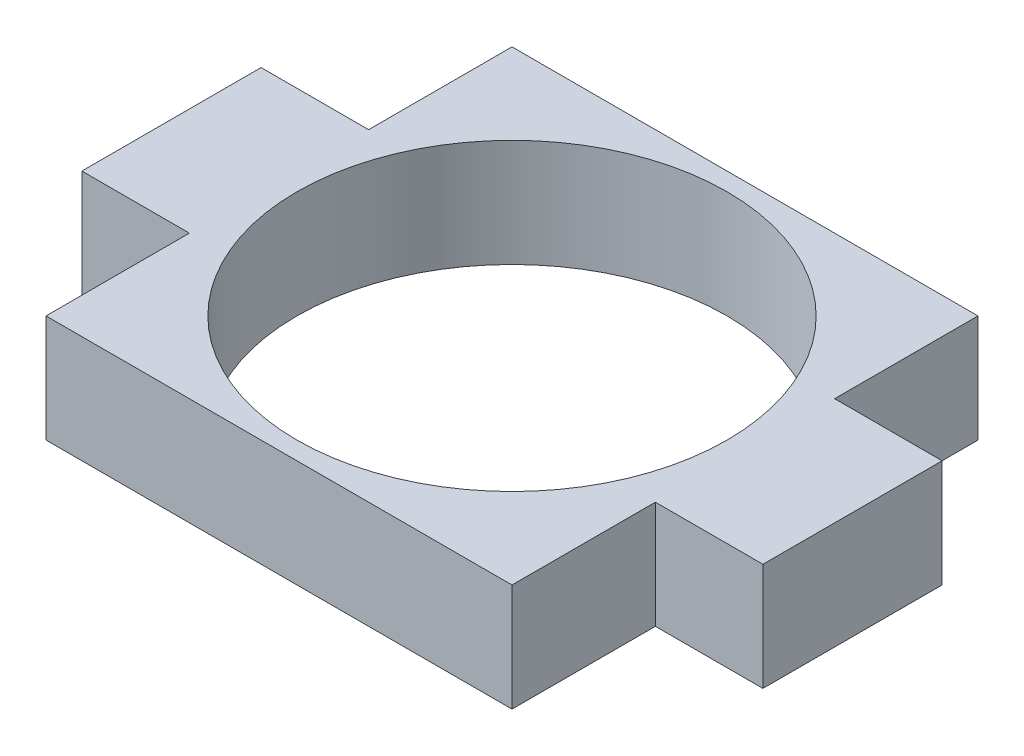
ISO-10303-21;
HEADER;
FILE_DESCRIPTION(('STEP AP214'),'2;1');
FILE_NAME('part.step','',(''),(''),'','','');
FILE_SCHEMA(('AUTOMOTIVE_DESIGN { 1 0 10303 214 1 1 1 1 }'));
ENDSEC;
DATA;
#1=APPLICATION_CONTEXT('core data for automotive mechanical design processes');
#2=APPLICATION_PROTOCOL_DEFINITION('international standard','automotive_design',2000,#1);
#3=PRODUCT_CONTEXT('',#1,'mechanical');
#4=PRODUCT('Part','Part','',(#3));
#5=PRODUCT_RELATED_PRODUCT_CATEGORY('part','',(#4));
#6=PRODUCT_DEFINITION_FORMATION('','',#4);
#7=PRODUCT_DEFINITION_CONTEXT('part definition',#1,'design');
#8=PRODUCT_DEFINITION('design','',#6,#7);
#9=PRODUCT_DEFINITION_SHAPE('','',#8);
#10=(LENGTH_UNIT() NAMED_UNIT(*) SI_UNIT(.MILLI.,.METRE.));
#11=(NAMED_UNIT(*) PLANE_ANGLE_UNIT() SI_UNIT($,.RADIAN.));
#12=(NAMED_UNIT(*) SI_UNIT($,.STERADIAN.) SOLID_ANGLE_UNIT());
#13=UNCERTAINTY_MEASURE_WITH_UNIT(LENGTH_MEASURE(1.E-05),#10,'distance_accuracy_value','');
#14=(GEOMETRIC_REPRESENTATION_CONTEXT(3) GLOBAL_UNCERTAINTY_ASSIGNED_CONTEXT((#13)) GLOBAL_UNIT_ASSIGNED_CONTEXT((#10,
#11,#12)) REPRESENTATION_CONTEXT('',''));
#15=CARTESIAN_POINT('',(0.,0.,0.));
#16=DIRECTION('',(0.,0.,1.));
#17=DIRECTION('',(1.,0.,0.));
#18=AXIS2_PLACEMENT_3D('',#15,#16,#17);
#19=CARTESIAN_POINT('',(-6.5,3.,6.5));
#20=DIRECTION('',(1.,0.,0.));
#21=DIRECTION('',(0.,0.,-1.));
#22=AXIS2_PLACEMENT_3D('',#19,#20,#21);
#23=PLANE('',#22);
#24=DIRECTION('',(0.,1.,0.));
#25=VECTOR('',#24,1.);
#26=CARTESIAN_POINT('',(-6.5,0.,2.5));
#27=LINE('',#26,#25);
#28=CARTESIAN_POINT('',(-6.5,0.,2.5));
#29=VERTEX_POINT('',#28);
#30=CARTESIAN_POINT('',(-6.5,3.,2.5));
#31=VERTEX_POINT('',#30);
#32=EDGE_CURVE('E203',#29,#31,#27,.T.);
#33=ORIENTED_EDGE('',*,*,#32,.F.);
#34=DIRECTION('',(0.,0.,1.));
#35=VECTOR('',#34,1.);
#36=CARTESIAN_POINT('',(-6.5,0.,6.5));
#37=LINE('',#36,#35);
#38=CARTESIAN_POINT('',(-6.5,0.,6.5));
#39=VERTEX_POINT('',#38);
#40=EDGE_CURVE('E152',#29,#39,#37,.T.);
#41=ORIENTED_EDGE('',*,*,#40,.T.);
#42=DIRECTION('',(0.,-1.,0.));
#43=VECTOR('',#42,1.);
#44=CARTESIAN_POINT('',(-6.5,3.,6.5));
#45=LINE('',#44,#43);
#46=CARTESIAN_POINT('',(-6.5,3.,6.5));
#47=VERTEX_POINT('',#46);
#48=EDGE_CURVE('E11',#47,#39,#45,.T.);
#49=ORIENTED_EDGE('',*,*,#48,.F.);
#50=DIRECTION('',(0.,0.,1.));
#51=VECTOR('',#50,1.);
#52=CARTESIAN_POINT('',(-6.5,3.,6.5));
#53=LINE('',#52,#51);
#54=EDGE_CURVE('E166',#31,#47,#53,.T.);
#55=ORIENTED_EDGE('',*,*,#54,.F.);
#56=EDGE_LOOP('',(#33,#41,#49,#55));
#57=FACE_BOUND('',#56,.T.);
#58=ADVANCED_FACE('F39',(#57),#23,.F.);
#59=CARTESIAN_POINT('',(6.5,3.,6.5));
#60=DIRECTION('',(-1.,0.,0.));
#61=DIRECTION('',(0.,0.,1.));
#62=AXIS2_PLACEMENT_3D('',#59,#60,#61);
#63=PLANE('',#62);
#64=DIRECTION('',(0.,1.,0.));
#65=VECTOR('',#64,1.);
#66=CARTESIAN_POINT('',(6.5,0.,-2.5));
#67=LINE('',#66,#65);
#68=CARTESIAN_POINT('',(6.5,0.,-2.5));
#69=VERTEX_POINT('',#68);
#70=CARTESIAN_POINT('',(6.5,3.,-2.5));
#71=VERTEX_POINT('',#70);
#72=EDGE_CURVE('E243',#69,#71,#67,.T.);
#73=ORIENTED_EDGE('',*,*,#72,.F.);
#74=DIRECTION('',(0.,0.,-1.));
#75=VECTOR('',#74,1.);
#76=CARTESIAN_POINT('',(6.5,0.,6.5));
#77=LINE('',#76,#75);
#78=CARTESIAN_POINT('',(6.5,0.,-6.5));
#79=VERTEX_POINT('',#78);
#80=EDGE_CURVE('E154',#69,#79,#77,.T.);
#81=ORIENTED_EDGE('',*,*,#80,.T.);
#82=DIRECTION('',(0.,-1.,0.));
#83=VECTOR('',#82,1.);
#84=CARTESIAN_POINT('',(6.5,3.,-6.5));
#85=LINE('',#84,#83);
#86=CARTESIAN_POINT('',(6.5,3.,-6.5));
#87=VERTEX_POINT('',#86);
#88=EDGE_CURVE('E168',#87,#79,#85,.T.);
#89=ORIENTED_EDGE('',*,*,#88,.F.);
#90=DIRECTION('',(0.,0.,-1.));
#91=VECTOR('',#90,1.);
#92=CARTESIAN_POINT('',(6.5,3.,6.5));
#93=LINE('',#92,#91);
#94=EDGE_CURVE('E207',#71,#87,#93,.T.);
#95=ORIENTED_EDGE('',*,*,#94,.F.);
#96=EDGE_LOOP('',(#73,#81,#89,#95));
#97=FACE_BOUND('',#96,.T.);
#98=ADVANCED_FACE('F217',(#97),#63,.F.);
#99=CARTESIAN_POINT('',(-6.5,0.,-6.5));
#100=VERTEX_POINT('',#99);
#101=CARTESIAN_POINT('',(-6.5,0.,-2.5));
#102=VERTEX_POINT('',#101);
#103=EDGE_CURVE('E142',#100,#102,#37,.T.);
#104=ORIENTED_EDGE('',*,*,#103,.T.);
#105=DIRECTION('',(0.,1.,0.));
#106=VECTOR('',#105,1.);
#107=CARTESIAN_POINT('',(-6.5,0.,-2.5));
#108=LINE('',#107,#106);
#109=CARTESIAN_POINT('',(-6.5,3.,-2.5));
#110=VERTEX_POINT('',#109);
#111=EDGE_CURVE('E126',#102,#110,#108,.T.);
#112=ORIENTED_EDGE('',*,*,#111,.T.);
#113=CARTESIAN_POINT('',(-6.5,3.,-6.5));
#114=VERTEX_POINT('',#113);
#115=EDGE_CURVE('E204',#114,#110,#53,.T.);
#116=ORIENTED_EDGE('',*,*,#115,.F.);
#117=DIRECTION('',(0.,-1.,0.));
#118=VECTOR('',#117,1.);
#119=CARTESIAN_POINT('',(-6.5,3.,-6.5));
#120=LINE('',#119,#118);
#121=EDGE_CURVE('E150',#114,#100,#120,.T.);
#122=ORIENTED_EDGE('',*,*,#121,.T.);
#123=EDGE_LOOP('',(#104,#112,#116,#122));
#124=FACE_BOUND('',#123,.T.);
#125=ADVANCED_FACE('F41',(#124),#23,.F.);
#126=CARTESIAN_POINT('',(6.5,3.,6.5));
#127=DIRECTION('',(0.,0.,-1.));
#128=DIRECTION('',(-1.,0.,0.));
#129=AXIS2_PLACEMENT_3D('',#126,#127,#128);
#130=PLANE('',#129);
#131=DIRECTION('',(1.,0.,0.));
#132=VECTOR('',#131,1.);
#133=CARTESIAN_POINT('',(6.5,0.,6.5));
#134=LINE('',#133,#132);
#135=CARTESIAN_POINT('',(6.5,0.,6.5));
#136=VERTEX_POINT('',#135);
#137=EDGE_CURVE('E151',#39,#136,#134,.T.);
#138=ORIENTED_EDGE('',*,*,#137,.T.);
#139=DIRECTION('',(0.,-1.,0.));
#140=VECTOR('',#139,1.);
#141=CARTESIAN_POINT('',(6.5,3.,6.5));
#142=LINE('',#141,#140);
#143=CARTESIAN_POINT('',(6.5,3.,6.5));
#144=VERTEX_POINT('',#143);
#145=EDGE_CURVE('E47',#144,#136,#142,.T.);
#146=ORIENTED_EDGE('',*,*,#145,.F.);
#147=DIRECTION('',(1.,0.,0.));
#148=VECTOR('',#147,1.);
#149=CARTESIAN_POINT('',(6.5,3.,6.5));
#150=LINE('',#149,#148);
#151=EDGE_CURVE('E206',#47,#144,#150,.T.);
#152=ORIENTED_EDGE('',*,*,#151,.F.);
#153=ORIENTED_EDGE('',*,*,#48,.T.);
#154=EDGE_LOOP('',(#138,#146,#152,#153));
#155=FACE_BOUND('',#154,.T.);
#156=ADVANCED_FACE('F272',(#155),#130,.F.);
#157=CARTESIAN_POINT('',(6.5,0.,2.5));
#158=VERTEX_POINT('',#157);
#159=EDGE_CURVE('E161',#136,#158,#77,.T.);
#160=ORIENTED_EDGE('',*,*,#159,.T.);
#161=DIRECTION('',(0.,1.,0.));
#162=VECTOR('',#161,1.);
#163=CARTESIAN_POINT('',(6.5,0.,2.5));
#164=LINE('',#163,#162);
#165=CARTESIAN_POINT('',(6.5,3.,2.5));
#166=VERTEX_POINT('',#165);
#167=EDGE_CURVE('E237',#158,#166,#164,.T.);
#168=ORIENTED_EDGE('',*,*,#167,.T.);
#169=EDGE_CURVE('E177',#144,#166,#93,.T.);
#170=ORIENTED_EDGE('',*,*,#169,.F.);
#171=ORIENTED_EDGE('',*,*,#145,.T.);
#172=EDGE_LOOP('',(#160,#168,#170,#171));
#173=FACE_BOUND('',#172,.T.);
#174=ADVANCED_FACE('F175',(#173),#63,.F.);
#175=CARTESIAN_POINT('',(6.5,3.,-6.5));
#176=DIRECTION('',(0.,0.,1.));
#177=DIRECTION('',(1.,0.,0.));
#178=AXIS2_PLACEMENT_3D('',#175,#176,#177);
#179=PLANE('',#178);
#180=DIRECTION('',(-1.,0.,0.));
#181=VECTOR('',#180,1.);
#182=CARTESIAN_POINT('',(6.5,0.,-6.5));
#183=LINE('',#182,#181);
#184=EDGE_CURVE('E164',#79,#100,#183,.T.);
#185=ORIENTED_EDGE('',*,*,#184,.T.);
#186=ORIENTED_EDGE('',*,*,#121,.F.);
#187=DIRECTION('',(-1.,0.,0.));
#188=VECTOR('',#187,1.);
#189=CARTESIAN_POINT('',(6.5,3.,-6.5));
#190=LINE('',#189,#188);
#191=EDGE_CURVE('E158',#87,#114,#190,.T.);
#192=ORIENTED_EDGE('',*,*,#191,.F.);
#193=ORIENTED_EDGE('',*,*,#88,.T.);
#194=EDGE_LOOP('',(#185,#186,#192,#193));
#195=FACE_BOUND('',#194,.T.);
#196=ADVANCED_FACE('F220',(#195),#179,.F.);
#197=CARTESIAN_POINT('',(0.,3.,0.));
#198=DIRECTION('',(0.,1.,0.));
#199=DIRECTION('',(0.,0.,1.));
#200=AXIS2_PLACEMENT_3D('',#197,#198,#199);
#201=PLANE('',#200);
#202=CARTESIAN_POINT('',(0.,3.,0.));
#203=DIRECTION('',(0.,1.,0.));
#204=DIRECTION('',(0.,0.,1.));
#205=AXIS2_PLACEMENT_3D('',#202,#203,#204);
#206=CIRCLE('',#205,6.);
#207=CARTESIAN_POINT('',(0.,3.,6.));
#208=VERTEX_POINT('',#207);
#209=EDGE_CURVE('E200',#208,#208,#206,.T.);
#210=ORIENTED_EDGE('',*,*,#209,.F.);
#211=EDGE_LOOP('',(#210));
#212=FACE_BOUND('',#211,.T.);
#213=ORIENTED_EDGE('',*,*,#115,.T.);
#214=DIRECTION('',(-1.,0.,0.));
#215=VECTOR('',#214,1.);
#216=CARTESIAN_POINT('',(-6.5,3.,-2.5));
#217=LINE('',#216,#215);
#218=CARTESIAN_POINT('',(-9.5,3.,-2.5));
#219=VERTEX_POINT('',#218);
#220=EDGE_CURVE('E54',#110,#219,#217,.T.);
#221=ORIENTED_EDGE('',*,*,#220,.T.);
#222=DIRECTION('',(0.,0.,1.));
#223=VECTOR('',#222,1.);
#224=CARTESIAN_POINT('',(-9.5,3.,-2.5));
#225=LINE('',#224,#223);
#226=CARTESIAN_POINT('',(-9.5,3.,2.5));
#227=VERTEX_POINT('',#226);
#228=EDGE_CURVE('E224',#219,#227,#225,.T.);
#229=ORIENTED_EDGE('',*,*,#228,.T.);
#230=DIRECTION('',(1.,0.,0.));
#231=VECTOR('',#230,1.);
#232=CARTESIAN_POINT('',(-6.5,3.,2.5));
#233=LINE('',#232,#231);
#234=EDGE_CURVE('E146',#227,#31,#233,.T.);
#235=ORIENTED_EDGE('',*,*,#234,.T.);
#236=ORIENTED_EDGE('',*,*,#54,.T.);
#237=ORIENTED_EDGE('',*,*,#151,.T.);
#238=ORIENTED_EDGE('',*,*,#169,.T.);
#239=DIRECTION('',(1.,0.,0.));
#240=VECTOR('',#239,1.);
#241=CARTESIAN_POINT('',(6.5,3.,2.5));
#242=LINE('',#241,#240);
#243=CARTESIAN_POINT('',(9.5,3.,2.5));
#244=VERTEX_POINT('',#243);
#245=EDGE_CURVE('E62',#166,#244,#242,.T.);
#246=ORIENTED_EDGE('',*,*,#245,.T.);
#247=DIRECTION('',(0.,0.,-1.));
#248=VECTOR('',#247,1.);
#249=CARTESIAN_POINT('',(9.5,3.,-2.5));
#250=LINE('',#249,#248);
#251=CARTESIAN_POINT('',(9.5,3.,-2.5));
#252=VERTEX_POINT('',#251);
#253=EDGE_CURVE('E192',#244,#252,#250,.T.);
#254=ORIENTED_EDGE('',*,*,#253,.T.);
#255=DIRECTION('',(-1.,0.,0.));
#256=VECTOR('',#255,1.);
#257=CARTESIAN_POINT('',(6.5,3.,-2.5));
#258=LINE('',#257,#256);
#259=EDGE_CURVE('E189',#252,#71,#258,.T.);
#260=ORIENTED_EDGE('',*,*,#259,.T.);
#261=ORIENTED_EDGE('',*,*,#94,.T.);
#262=ORIENTED_EDGE('',*,*,#191,.T.);
#263=EDGE_LOOP('',(#213,#221,#229,#235,#236,#237,#238,#246,#254,#260,#261,#262));
#264=FACE_BOUND('',#263,.T.);
#265=ADVANCED_FACE('F211',(#212,#264),#201,.T.);
#266=CARTESIAN_POINT('',(0.,0.,0.));
#267=DIRECTION('',(0.,1.,0.));
#268=DIRECTION('',(0.,0.,1.));
#269=AXIS2_PLACEMENT_3D('',#266,#267,#268);
#270=PLANE('',#269);
#271=CARTESIAN_POINT('',(0.,0.,0.));
#272=DIRECTION('',(0.,1.,0.));
#273=DIRECTION('',(0.,0.,1.));
#274=AXIS2_PLACEMENT_3D('',#271,#272,#273);
#275=CIRCLE('',#274,6.);
#276=CARTESIAN_POINT('',(0.,0.,6.));
#277=VERTEX_POINT('',#276);
#278=EDGE_CURVE('E156',#277,#277,#275,.T.);
#279=ORIENTED_EDGE('',*,*,#278,.T.);
#280=EDGE_LOOP('',(#279));
#281=FACE_BOUND('',#280,.T.);
#282=ORIENTED_EDGE('',*,*,#103,.F.);
#283=ORIENTED_EDGE('',*,*,#184,.F.);
#284=ORIENTED_EDGE('',*,*,#80,.F.);
#285=DIRECTION('',(-1.,0.,0.));
#286=VECTOR('',#285,1.);
#287=CARTESIAN_POINT('',(6.5,0.,-2.5));
#288=LINE('',#287,#286);
#289=CARTESIAN_POINT('',(9.5,0.,-2.5));
#290=VERTEX_POINT('',#289);
#291=EDGE_CURVE('E194',#290,#69,#288,.T.);
#292=ORIENTED_EDGE('',*,*,#291,.F.);
#293=DIRECTION('',(0.,0.,-1.));
#294=VECTOR('',#293,1.);
#295=CARTESIAN_POINT('',(9.5,0.,-2.5));
#296=LINE('',#295,#294);
#297=CARTESIAN_POINT('',(9.5,0.,2.5));
#298=VERTEX_POINT('',#297);
#299=EDGE_CURVE('E188',#298,#290,#296,.T.);
#300=ORIENTED_EDGE('',*,*,#299,.F.);
#301=DIRECTION('',(1.,0.,0.));
#302=VECTOR('',#301,1.);
#303=CARTESIAN_POINT('',(6.5,0.,2.5));
#304=LINE('',#303,#302);
#305=EDGE_CURVE('E185',#158,#298,#304,.T.);
#306=ORIENTED_EDGE('',*,*,#305,.F.);
#307=ORIENTED_EDGE('',*,*,#159,.F.);
#308=ORIENTED_EDGE('',*,*,#137,.F.);
#309=ORIENTED_EDGE('',*,*,#40,.F.);
#310=DIRECTION('',(1.,0.,0.));
#311=VECTOR('',#310,1.);
#312=CARTESIAN_POINT('',(-6.5,0.,2.5));
#313=LINE('',#312,#311);
#314=CARTESIAN_POINT('',(-9.5,0.,2.5));
#315=VERTEX_POINT('',#314);
#316=EDGE_CURVE('E135',#315,#29,#313,.T.);
#317=ORIENTED_EDGE('',*,*,#316,.F.);
#318=DIRECTION('',(0.,0.,1.));
#319=VECTOR('',#318,1.);
#320=CARTESIAN_POINT('',(-9.5,0.,-2.5));
#321=LINE('',#320,#319);
#322=CARTESIAN_POINT('',(-9.5,0.,-2.5));
#323=VERTEX_POINT('',#322);
#324=EDGE_CURVE('E145',#323,#315,#321,.T.);
#325=ORIENTED_EDGE('',*,*,#324,.F.);
#326=DIRECTION('',(-1.,0.,0.));
#327=VECTOR('',#326,1.);
#328=CARTESIAN_POINT('',(-6.5,0.,-2.5));
#329=LINE('',#328,#327);
#330=EDGE_CURVE('E129',#102,#323,#329,.T.);
#331=ORIENTED_EDGE('',*,*,#330,.F.);
#332=EDGE_LOOP('',(#282,#283,#284,#292,#300,#306,#307,#308,#309,#317,#325,#331));
#333=FACE_BOUND('',#332,.T.);
#334=ADVANCED_FACE('F140',(#281,#333),#270,.F.);
#335=CARTESIAN_POINT('',(0.,0.,0.));
#336=DIRECTION('',(0.,1.,0.));
#337=DIRECTION('',(0.,0.,1.));
#338=AXIS2_PLACEMENT_3D('',#335,#336,#337);
#339=CYLINDRICAL_SURFACE('',#338,6.);
#340=ORIENTED_EDGE('',*,*,#278,.F.);
#341=EDGE_LOOP('',(#340));
#342=FACE_BOUND('',#341,.T.);
#343=ORIENTED_EDGE('',*,*,#209,.T.);
#344=EDGE_LOOP('',(#343));
#345=FACE_BOUND('',#344,.T.);
#346=ADVANCED_FACE('F284',(#342,#345),#339,.F.);
#347=CARTESIAN_POINT('',(6.5,0.,-2.5));
#348=DIRECTION('',(0.,0.,-1.));
#349=DIRECTION('',(-1.,0.,0.));
#350=AXIS2_PLACEMENT_3D('',#347,#348,#349);
#351=PLANE('',#350);
#352=ORIENTED_EDGE('',*,*,#259,.F.);
#353=DIRECTION('',(0.,1.,0.));
#354=VECTOR('',#353,1.);
#355=CARTESIAN_POINT('',(9.5,0.,-2.5));
#356=LINE('',#355,#354);
#357=EDGE_CURVE('E241',#290,#252,#356,.T.);
#358=ORIENTED_EDGE('',*,*,#357,.F.);
#359=ORIENTED_EDGE('',*,*,#291,.T.);
#360=ORIENTED_EDGE('',*,*,#72,.T.);
#361=EDGE_LOOP('',(#352,#358,#359,#360));
#362=FACE_BOUND('',#361,.T.);
#363=ADVANCED_FACE('F246',(#362),#351,.T.);
#364=CARTESIAN_POINT('',(9.5,0.,-2.5));
#365=DIRECTION('',(1.,0.,0.));
#366=DIRECTION('',(0.,0.,-1.));
#367=AXIS2_PLACEMENT_3D('',#364,#365,#366);
#368=PLANE('',#367);
#369=ORIENTED_EDGE('',*,*,#253,.F.);
#370=DIRECTION('',(0.,1.,0.));
#371=VECTOR('',#370,1.);
#372=CARTESIAN_POINT('',(9.5,0.,2.5));
#373=LINE('',#372,#371);
#374=EDGE_CURVE('E239',#298,#244,#373,.T.);
#375=ORIENTED_EDGE('',*,*,#374,.F.);
#376=ORIENTED_EDGE('',*,*,#299,.T.);
#377=ORIENTED_EDGE('',*,*,#357,.T.);
#378=EDGE_LOOP('',(#369,#375,#376,#377));
#379=FACE_BOUND('',#378,.T.);
#380=ADVANCED_FACE('F249',(#379),#368,.T.);
#381=CARTESIAN_POINT('',(6.5,0.,2.5));
#382=DIRECTION('',(0.,0.,1.));
#383=DIRECTION('',(1.,0.,0.));
#384=AXIS2_PLACEMENT_3D('',#381,#382,#383);
#385=PLANE('',#384);
#386=ORIENTED_EDGE('',*,*,#245,.F.);
#387=ORIENTED_EDGE('',*,*,#167,.F.);
#388=ORIENTED_EDGE('',*,*,#305,.T.);
#389=ORIENTED_EDGE('',*,*,#374,.T.);
#390=EDGE_LOOP('',(#386,#387,#388,#389));
#391=FACE_BOUND('',#390,.T.);
#392=ADVANCED_FACE('F250',(#391),#385,.T.);
#393=CARTESIAN_POINT('',(-6.5,0.,2.5));
#394=DIRECTION('',(0.,0.,1.));
#395=DIRECTION('',(1.,0.,0.));
#396=AXIS2_PLACEMENT_3D('',#393,#394,#395);
#397=PLANE('',#396);
#398=ORIENTED_EDGE('',*,*,#234,.F.);
#399=DIRECTION('',(0.,1.,0.));
#400=VECTOR('',#399,1.);
#401=CARTESIAN_POINT('',(-9.5,0.,2.5));
#402=LINE('',#401,#400);
#403=EDGE_CURVE('E234',#315,#227,#402,.T.);
#404=ORIENTED_EDGE('',*,*,#403,.F.);
#405=ORIENTED_EDGE('',*,*,#316,.T.);
#406=ORIENTED_EDGE('',*,*,#32,.T.);
#407=EDGE_LOOP('',(#398,#404,#405,#406));
#408=FACE_BOUND('',#407,.T.);
#409=ADVANCED_FACE('F252',(#408),#397,.T.);
#410=CARTESIAN_POINT('',(-9.5,0.,-2.5));
#411=DIRECTION('',(-1.,0.,0.));
#412=DIRECTION('',(0.,0.,1.));
#413=AXIS2_PLACEMENT_3D('',#410,#411,#412);
#414=PLANE('',#413);
#415=ORIENTED_EDGE('',*,*,#228,.F.);
#416=DIRECTION('',(0.,1.,0.));
#417=VECTOR('',#416,1.);
#418=CARTESIAN_POINT('',(-9.5,0.,-2.5));
#419=LINE('',#418,#417);
#420=EDGE_CURVE('E134',#323,#219,#419,.T.);
#421=ORIENTED_EDGE('',*,*,#420,.F.);
#422=ORIENTED_EDGE('',*,*,#324,.T.);
#423=ORIENTED_EDGE('',*,*,#403,.T.);
#424=EDGE_LOOP('',(#415,#421,#422,#423));
#425=FACE_BOUND('',#424,.T.);
#426=ADVANCED_FACE('F258',(#425),#414,.T.);
#427=CARTESIAN_POINT('',(-6.5,0.,-2.5));
#428=DIRECTION('',(0.,0.,-1.));
#429=DIRECTION('',(-1.,0.,0.));
#430=AXIS2_PLACEMENT_3D('',#427,#428,#429);
#431=PLANE('',#430);
#432=ORIENTED_EDGE('',*,*,#220,.F.);
#433=ORIENTED_EDGE('',*,*,#111,.F.);
#434=ORIENTED_EDGE('',*,*,#330,.T.);
#435=ORIENTED_EDGE('',*,*,#420,.T.);
#436=EDGE_LOOP('',(#432,#433,#434,#435));
#437=FACE_BOUND('',#436,.T.);
#438=ADVANCED_FACE('F128',(#437),#431,.T.);
#439=CLOSED_SHELL('',(#58,#98,#125,#156,#174,#196,#265,#334,#346,#363,#380,#392,#409,#426,#438));
#440=MANIFOLD_SOLID_BREP('B2',#439);
#441=ADVANCED_BREP_SHAPE_REPRESENTATION('',(#18,#440),#14);
#442=SHAPE_DEFINITION_REPRESENTATION(#9,#441);
ENDSEC;
END-ISO-10303-21;
